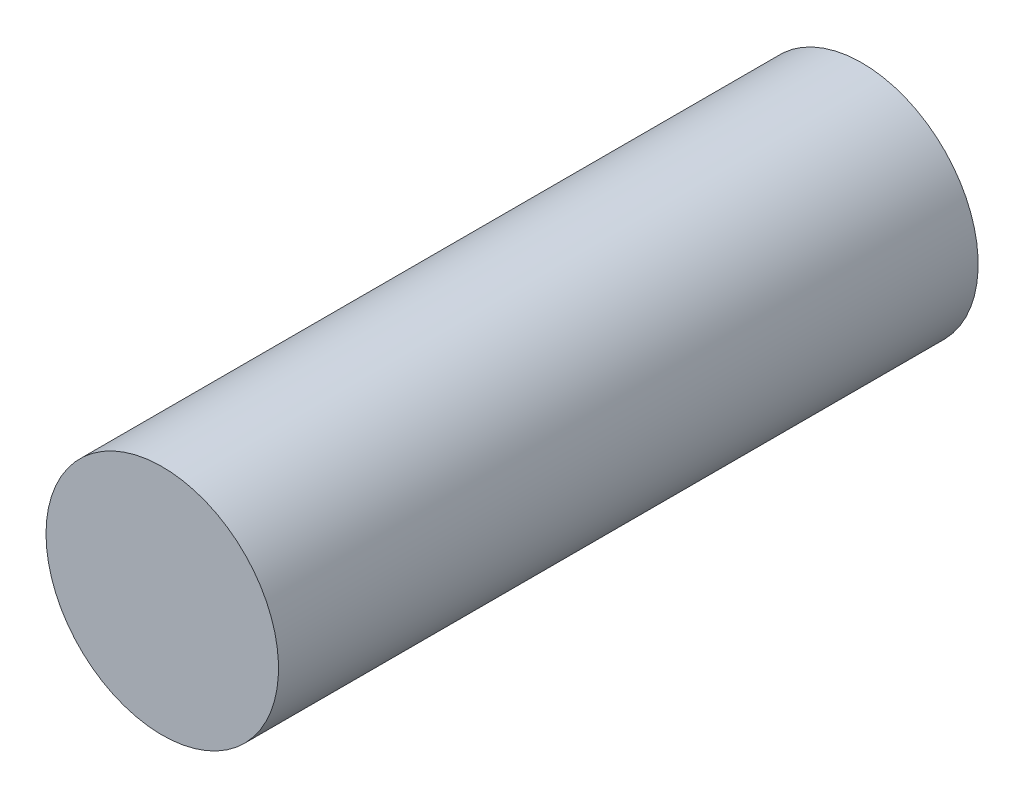
ISO-10303-21;
HEADER;
FILE_DESCRIPTION(('STEP AP214'),'2;1');
FILE_NAME('part.step','',(''),(''),'','','');
FILE_SCHEMA(('AUTOMOTIVE_DESIGN { 1 0 10303 214 1 1 1 1 }'));
ENDSEC;
DATA;
#1=APPLICATION_CONTEXT('core data for automotive mechanical design processes');
#2=APPLICATION_PROTOCOL_DEFINITION('international standard','automotive_design',2000,#1);
#3=PRODUCT_CONTEXT('',#1,'mechanical');
#4=PRODUCT('Part','Part','',(#3));
#5=PRODUCT_RELATED_PRODUCT_CATEGORY('part','',(#4));
#6=PRODUCT_DEFINITION_FORMATION('','',#4);
#7=PRODUCT_DEFINITION_CONTEXT('part definition',#1,'design');
#8=PRODUCT_DEFINITION('design','',#6,#7);
#9=PRODUCT_DEFINITION_SHAPE('','',#8);
#10=(LENGTH_UNIT() NAMED_UNIT(*) SI_UNIT(.MILLI.,.METRE.));
#11=(NAMED_UNIT(*) PLANE_ANGLE_UNIT() SI_UNIT($,.RADIAN.));
#12=(NAMED_UNIT(*) SI_UNIT($,.STERADIAN.) SOLID_ANGLE_UNIT());
#13=UNCERTAINTY_MEASURE_WITH_UNIT(LENGTH_MEASURE(1.E-05),#10,'distance_accuracy_value','');
#14=(GEOMETRIC_REPRESENTATION_CONTEXT(3) GLOBAL_UNCERTAINTY_ASSIGNED_CONTEXT((#13)) GLOBAL_UNIT_ASSIGNED_CONTEXT((#10,
#11,#12)) REPRESENTATION_CONTEXT('',''));
#15=CARTESIAN_POINT('',(0.,0.,0.));
#16=DIRECTION('',(0.,0.,1.));
#17=DIRECTION('',(1.,0.,0.));
#18=AXIS2_PLACEMENT_3D('',#15,#16,#17);
#19=CARTESIAN_POINT('',(0.,0.,76.2));
#20=DIRECTION('',(0.,0.,-1.));
#21=DIRECTION('',(-1.,0.,0.));
#22=AXIS2_PLACEMENT_3D('',#19,#20,#21);
#23=CYLINDRICAL_SURFACE('',#22,12.6619);
#24=CARTESIAN_POINT('',(0.,0.,76.2));
#25=DIRECTION('',(0.,0.,1.));
#26=DIRECTION('',(1.,0.,0.));
#27=AXIS2_PLACEMENT_3D('',#24,#25,#26);
#28=CIRCLE('',#27,12.6619);
#29=CARTESIAN_POINT('',(-12.6619,0.,76.2));
#30=VERTEX_POINT('',#29);
#31=EDGE_CURVE('E10',#30,#30,#28,.T.);
#32=CARTESIAN_POINT('',(0.,0.,0.));
#33=DIRECTION('',(0.,0.,1.));
#34=DIRECTION('',(1.,0.,0.));
#35=AXIS2_PLACEMENT_3D('',#32,#33,#34);
#36=CIRCLE('',#35,12.6619);
#37=CARTESIAN_POINT('',(-12.6619,0.,0.));
#38=VERTEX_POINT('',#37);
#39=EDGE_CURVE('E46',#38,#38,#36,.T.);
#40=CARTESIAN_POINT('',(-12.6619,0.,76.2));
#41=CARTESIAN_POINT('',(-12.6619,0.,75.40625));
#42=CARTESIAN_POINT('',(-12.6619,0.,74.6125));
#43=CARTESIAN_POINT('',(-12.6619,0.,73.025));
#44=CARTESIAN_POINT('',(-12.6619,0.,72.23125));
#45=CARTESIAN_POINT('',(-12.6619,0.,70.64375));
#46=CARTESIAN_POINT('',(-12.6619,0.,69.85));
#47=CARTESIAN_POINT('',(-12.6619,0.,68.2625));
#48=CARTESIAN_POINT('',(-12.6619,0.,67.46875));
#49=CARTESIAN_POINT('',(-12.6619,0.,65.88125));
#50=CARTESIAN_POINT('',(-12.6619,0.,65.0875));
#51=CARTESIAN_POINT('',(-12.6619,0.,63.5));
#52=CARTESIAN_POINT('',(-12.6619,0.,62.70625));
#53=CARTESIAN_POINT('',(-12.6619,0.,61.11875));
#54=CARTESIAN_POINT('',(-12.6619,0.,60.325));
#55=CARTESIAN_POINT('',(-12.6619,0.,58.7375));
#56=CARTESIAN_POINT('',(-12.6619,0.,57.94375));
#57=CARTESIAN_POINT('',(-12.6619,0.,56.35625));
#58=CARTESIAN_POINT('',(-12.6619,0.,55.5625));
#59=CARTESIAN_POINT('',(-12.6619,0.,53.975));
#60=CARTESIAN_POINT('',(-12.6619,0.,53.18125));
#61=CARTESIAN_POINT('',(-12.6619,0.,51.59375));
#62=CARTESIAN_POINT('',(-12.6619,0.,50.8));
#63=CARTESIAN_POINT('',(-12.6619,0.,49.2125));
#64=CARTESIAN_POINT('',(-12.6619,0.,48.41875));
#65=CARTESIAN_POINT('',(-12.6619,0.,46.83125));
#66=CARTESIAN_POINT('',(-12.6619,0.,46.0375));
#67=CARTESIAN_POINT('',(-12.6619,0.,44.45));
#68=CARTESIAN_POINT('',(-12.6619,0.,43.65625));
#69=CARTESIAN_POINT('',(-12.6619,0.,42.06875));
#70=CARTESIAN_POINT('',(-12.6619,0.,41.275));
#71=CARTESIAN_POINT('',(-12.6619,0.,39.6875));
#72=CARTESIAN_POINT('',(-12.6619,0.,38.89375));
#73=CARTESIAN_POINT('',(-12.6619,0.,37.30625));
#74=CARTESIAN_POINT('',(-12.6619,0.,36.5125));
#75=CARTESIAN_POINT('',(-12.6619,0.,34.925));
#76=CARTESIAN_POINT('',(-12.6619,0.,34.13125));
#77=CARTESIAN_POINT('',(-12.6619,0.,32.54375));
#78=CARTESIAN_POINT('',(-12.6619,0.,31.75));
#79=CARTESIAN_POINT('',(-12.6619,0.,30.1625));
#80=CARTESIAN_POINT('',(-12.6619,0.,29.36875));
#81=CARTESIAN_POINT('',(-12.6619,0.,27.78125));
#82=CARTESIAN_POINT('',(-12.6619,0.,26.9875));
#83=CARTESIAN_POINT('',(-12.6619,0.,25.4));
#84=CARTESIAN_POINT('',(-12.6619,0.,24.60625));
#85=CARTESIAN_POINT('',(-12.6619,0.,23.01875));
#86=CARTESIAN_POINT('',(-12.6619,0.,22.225));
#87=CARTESIAN_POINT('',(-12.6619,0.,20.6375));
#88=CARTESIAN_POINT('',(-12.6619,0.,19.84375));
#89=CARTESIAN_POINT('',(-12.6619,0.,18.25625));
#90=CARTESIAN_POINT('',(-12.6619,0.,17.4625));
#91=CARTESIAN_POINT('',(-12.6619,0.,15.875));
#92=CARTESIAN_POINT('',(-12.6619,0.,15.08125));
#93=CARTESIAN_POINT('',(-12.6619,0.,13.49375));
#94=CARTESIAN_POINT('',(-12.6619,0.,12.7));
#95=CARTESIAN_POINT('',(-12.6619,0.,11.1125));
#96=CARTESIAN_POINT('',(-12.6619,0.,10.31875));
#97=CARTESIAN_POINT('',(-12.6619,0.,8.73125));
#98=CARTESIAN_POINT('',(-12.6619,0.,7.93750000000001));
#99=CARTESIAN_POINT('',(-12.6619,0.,6.35));
#100=CARTESIAN_POINT('',(-12.6619,0.,5.55625));
#101=CARTESIAN_POINT('',(-12.6619,0.,3.96875));
#102=CARTESIAN_POINT('',(-12.6619,0.,3.175));
#103=CARTESIAN_POINT('',(-12.6619,0.,1.5875));
#104=CARTESIAN_POINT('',(-12.6619,0.,0.793750000000001));
#105=CARTESIAN_POINT('',(-12.6619,0.,0.));
#106=B_SPLINE_CURVE_WITH_KNOTS('',3,(#40,#41,#42,#43,#44,#45,#46,#47,#48,#49,#50,#51,#52,#53,
#54,#55,#56,#57,#58,#59,#60,#61,#62,#63,#64,#65,#66,#67,#68,#69,#70,#71,#72,#73,#74,#75,#76,#77,
#78,#79,#80,#81,#82,#83,#84,#85,#86,#87,#88,#89,#90,#91,#92,#93,#94,#95,#96,#97,#98,#99,#100,
#101,#102,#103,#104,#105),.UNSPECIFIED.,.F.,.F.,(4,2,2,2,2,2,2,2,2,2,2,2,2,2,2,2,2,2,2,2,2,2,2,
2,2,2,2,2,2,2,2,2,4),(0.,2.38124999999999,4.76249999999999,7.14374999999999,9.52499999999999,
11.90625,14.2875,16.66875,19.05,21.43125,23.8125,26.19375,28.575,30.95625,33.3375,35.71875,38.1,
40.48125,42.8625,45.24375,47.625,50.00625,52.3875,54.76875,57.15,59.53125,61.9125,64.29375,
66.675,69.05625,71.4375,73.81875,76.2),.UNSPECIFIED.);
#107=EDGE_CURVE('BSEAM43',#30,#38,#106,.T.);
#108=ORIENTED_EDGE('',*,*,#31,.F.);
#109=ORIENTED_EDGE('',*,*,#39,.T.);
#110=ORIENTED_EDGE('',*,*,#107,.T.);
#111=ORIENTED_EDGE('',*,*,#107,.F.);
#112=EDGE_LOOP('',(#108,#110,#109,#111));
#113=FACE_BOUND('',#112,.T.);
#114=ADVANCED_FACE('F43',(#113),#23,.T.);
#115=CARTESIAN_POINT('',(0.,0.,76.2));
#116=DIRECTION('',(0.,0.,1.));
#117=DIRECTION('',(1.,0.,0.));
#118=AXIS2_PLACEMENT_3D('',#115,#116,#117);
#119=PLANE('',#118);
#120=ORIENTED_EDGE('',*,*,#31,.T.);
#121=EDGE_LOOP('',(#120));
#122=FACE_BOUND('',#121,.T.);
#123=ADVANCED_FACE('F60',(#122),#119,.T.);
#124=CARTESIAN_POINT('',(0.,0.,0.));
#125=DIRECTION('',(0.,0.,1.));
#126=DIRECTION('',(1.,0.,0.));
#127=AXIS2_PLACEMENT_3D('',#124,#125,#126);
#128=PLANE('',#127);
#129=ORIENTED_EDGE('',*,*,#39,.F.);
#130=EDGE_LOOP('',(#129));
#131=FACE_BOUND('',#130,.T.);
#132=ADVANCED_FACE('F58',(#131),#128,.F.);
#133=CLOSED_SHELL('',(#114,#123,#132));
#134=MANIFOLD_SOLID_BREP('B2',#133);
#135=ADVANCED_BREP_SHAPE_REPRESENTATION('',(#18,#134),#14);
#136=SHAPE_DEFINITION_REPRESENTATION(#9,#135);
ENDSEC;
END-ISO-10303-21;
